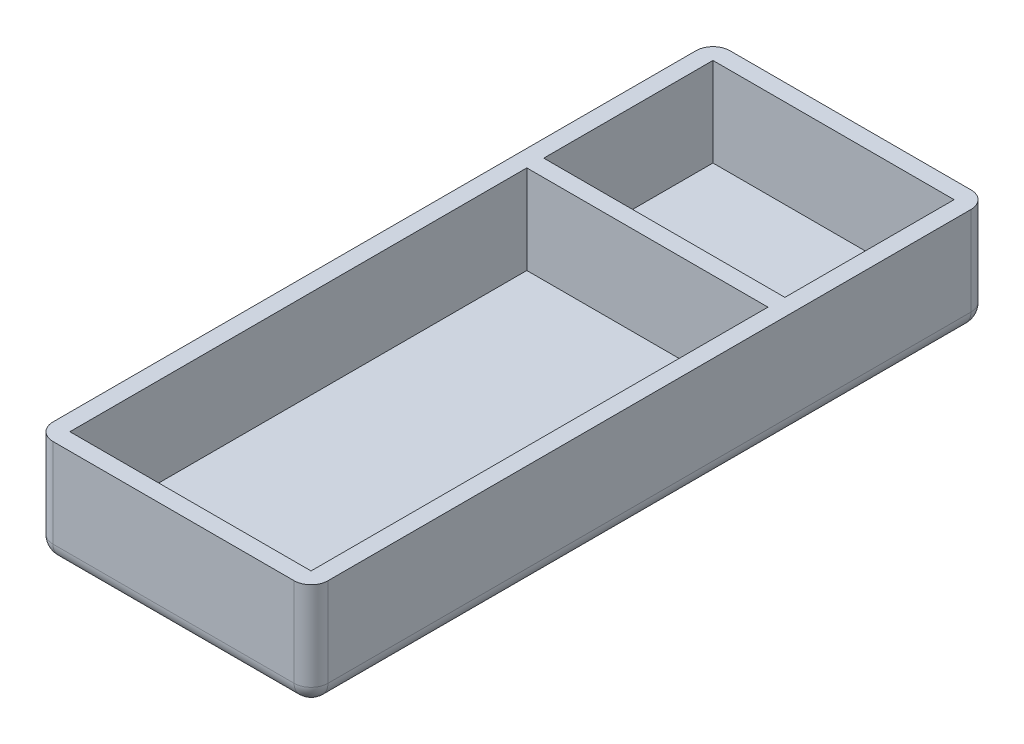
ISO-10303-21;
HEADER;
FILE_DESCRIPTION(('STEP AP214'),'2;1');
FILE_NAME('part.step','',(''),(''),'','','');
FILE_SCHEMA(('AUTOMOTIVE_DESIGN { 1 0 10303 214 1 1 1 1 }'));
ENDSEC;
DATA;
#1=APPLICATION_CONTEXT('core data for automotive mechanical design processes');
#2=APPLICATION_PROTOCOL_DEFINITION('international standard','automotive_design',2000,#1);
#3=PRODUCT_CONTEXT('',#1,'mechanical');
#4=PRODUCT('Part','Part','',(#3));
#5=PRODUCT_RELATED_PRODUCT_CATEGORY('part','',(#4));
#6=PRODUCT_DEFINITION_FORMATION('','',#4);
#7=PRODUCT_DEFINITION_CONTEXT('part definition',#1,'design');
#8=PRODUCT_DEFINITION('design','',#6,#7);
#9=PRODUCT_DEFINITION_SHAPE('','',#8);
#10=(LENGTH_UNIT() NAMED_UNIT(*) SI_UNIT(.MILLI.,.METRE.));
#11=(NAMED_UNIT(*) PLANE_ANGLE_UNIT() SI_UNIT($,.RADIAN.));
#12=(NAMED_UNIT(*) SI_UNIT($,.STERADIAN.) SOLID_ANGLE_UNIT());
#13=UNCERTAINTY_MEASURE_WITH_UNIT(LENGTH_MEASURE(1.E-05),#10,'distance_accuracy_value','');
#14=(GEOMETRIC_REPRESENTATION_CONTEXT(3) GLOBAL_UNCERTAINTY_ASSIGNED_CONTEXT((#13)) GLOBAL_UNIT_ASSIGNED_CONTEXT((#10,
#11,#12)) REPRESENTATION_CONTEXT('',''));
#15=CARTESIAN_POINT('',(0.,0.,0.));
#16=DIRECTION('',(0.,0.,1.));
#17=DIRECTION('',(1.,0.,0.));
#18=AXIS2_PLACEMENT_3D('',#15,#16,#17);
#19=CARTESIAN_POINT('',(28.5,-162.336071161033,76.));
#20=DIRECTION('',(1.,0.,0.));
#21=DIRECTION('',(0.,0.,-1.));
#22=AXIS2_PLACEMENT_3D('',#19,#20,#21);
#23=PLANE('',#22);
#24=DIRECTION('',(0.,-1.,0.));
#25=VECTOR('',#24,1.);
#26=CARTESIAN_POINT('',(28.5,82.1401785086466,-36.));
#27=LINE('',#26,#25);
#28=CARTESIAN_POINT('',(28.5,25.,-36.));
#29=VERTEX_POINT('',#28);
#30=CARTESIAN_POINT('',(28.5,4.,-36.));
#31=VERTEX_POINT('',#30);
#32=EDGE_CURVE('E191',#29,#31,#27,.T.);
#33=ORIENTED_EDGE('',*,*,#32,.F.);
#34=DIRECTION('',(0.,0.,-1.));
#35=VECTOR('',#34,1.);
#36=CARTESIAN_POINT('',(28.5,25.,76.));
#37=LINE('',#36,#35);
#38=CARTESIAN_POINT('',(28.5,25.,-76.));
#39=VERTEX_POINT('',#38);
#40=EDGE_CURVE('E209',#29,#39,#37,.T.);
#41=ORIENTED_EDGE('',*,*,#40,.T.);
#42=DIRECTION('',(0.,1.,0.));
#43=VECTOR('',#42,1.);
#44=CARTESIAN_POINT('',(28.5,-162.336071161033,-76.));
#45=LINE('',#44,#43);
#46=CARTESIAN_POINT('',(28.5,4.,-76.));
#47=VERTEX_POINT('',#46);
#48=EDGE_CURVE('E244',#47,#39,#45,.T.);
#49=ORIENTED_EDGE('',*,*,#48,.F.);
#50=DIRECTION('',(0.,0.,1.));
#51=VECTOR('',#50,1.);
#52=CARTESIAN_POINT('',(28.5,4.,76.));
#53=LINE('',#52,#51);
#54=EDGE_CURVE('E181',#47,#31,#53,.T.);
#55=ORIENTED_EDGE('',*,*,#54,.T.);
#56=EDGE_LOOP('',(#33,#41,#49,#55));
#57=FACE_BOUND('',#56,.T.);
#58=ADVANCED_FACE('F48',(#57),#23,.F.);
#59=CARTESIAN_POINT('',(-28.5,-162.336071161033,76.));
#60=DIRECTION('',(-1.,0.,0.));
#61=DIRECTION('',(0.,0.,1.));
#62=AXIS2_PLACEMENT_3D('',#59,#60,#61);
#63=PLANE('',#62);
#64=DIRECTION('',(0.,-1.,0.));
#65=VECTOR('',#64,1.);
#66=CARTESIAN_POINT('',(-28.5,82.1401785086466,-32.));
#67=LINE('',#66,#65);
#68=CARTESIAN_POINT('',(-28.5,25.,-32.));
#69=VERTEX_POINT('',#68);
#70=CARTESIAN_POINT('',(-28.5,4.,-32.));
#71=VERTEX_POINT('',#70);
#72=EDGE_CURVE('E196',#69,#71,#67,.T.);
#73=ORIENTED_EDGE('',*,*,#72,.F.);
#74=DIRECTION('',(0.,0.,1.));
#75=VECTOR('',#74,1.);
#76=CARTESIAN_POINT('',(-28.5,25.,76.));
#77=LINE('',#76,#75);
#78=CARTESIAN_POINT('',(-28.5,25.,76.));
#79=VERTEX_POINT('',#78);
#80=EDGE_CURVE('E233',#69,#79,#77,.T.);
#81=ORIENTED_EDGE('',*,*,#80,.T.);
#82=DIRECTION('',(0.,1.,0.));
#83=VECTOR('',#82,1.);
#84=CARTESIAN_POINT('',(-28.5,-162.336071161033,76.));
#85=LINE('',#84,#83);
#86=CARTESIAN_POINT('',(-28.5,4.,76.));
#87=VERTEX_POINT('',#86);
#88=EDGE_CURVE('E249',#87,#79,#85,.T.);
#89=ORIENTED_EDGE('',*,*,#88,.F.);
#90=DIRECTION('',(0.,0.,-1.));
#91=VECTOR('',#90,1.);
#92=CARTESIAN_POINT('',(-28.5,4.,76.));
#93=LINE('',#92,#91);
#94=EDGE_CURVE('E219',#87,#71,#93,.T.);
#95=ORIENTED_EDGE('',*,*,#94,.T.);
#96=EDGE_LOOP('',(#73,#81,#89,#95));
#97=FACE_BOUND('',#96,.T.);
#98=ADVANCED_FACE('F437',(#97),#63,.F.);
#99=CARTESIAN_POINT('',(0.,4.,0.));
#100=DIRECTION('',(0.,1.,0.));
#101=DIRECTION('',(0.,0.,1.));
#102=AXIS2_PLACEMENT_3D('',#99,#100,#101);
#103=PLANE('',#102);
#104=DIRECTION('',(-1.,0.,0.));
#105=VECTOR('',#104,1.);
#106=CARTESIAN_POINT('',(-28.5,4.,-36.));
#107=LINE('',#106,#105);
#108=CARTESIAN_POINT('',(-28.5,4.,-36.));
#109=VERTEX_POINT('',#108);
#110=EDGE_CURVE('E206',#31,#109,#107,.T.);
#111=ORIENTED_EDGE('',*,*,#110,.F.);
#112=ORIENTED_EDGE('',*,*,#54,.F.);
#113=DIRECTION('',(1.,0.,0.));
#114=VECTOR('',#113,1.);
#115=CARTESIAN_POINT('',(-28.5,4.,-76.));
#116=LINE('',#115,#114);
#117=CARTESIAN_POINT('',(-28.5,3.99999999999995,-76.));
#118=VERTEX_POINT('',#117);
#119=EDGE_CURVE('E229',#118,#47,#116,.T.);
#120=ORIENTED_EDGE('',*,*,#119,.F.);
#121=EDGE_CURVE('E224',#109,#118,#93,.T.);
#122=ORIENTED_EDGE('',*,*,#121,.F.);
#123=EDGE_LOOP('',(#111,#112,#120,#122));
#124=FACE_BOUND('',#123,.T.);
#125=ADVANCED_FACE('F443',(#124),#103,.T.);
#126=CARTESIAN_POINT('',(-32.5,25.,-80.));
#127=DIRECTION('',(1.,0.,0.));
#128=DIRECTION('',(0.,0.,-1.));
#129=AXIS2_PLACEMENT_3D('',#126,#127,#128);
#130=PLANE('',#129);
#131=DIRECTION('',(0.,0.,1.));
#132=VECTOR('',#131,1.);
#133=CARTESIAN_POINT('',(-32.5,4.,-80.));
#134=LINE('',#133,#132);
#135=CARTESIAN_POINT('',(-32.5,4.,-76.));
#136=VERTEX_POINT('',#135);
#137=CARTESIAN_POINT('',(-32.5,4.,76.));
#138=VERTEX_POINT('',#137);
#139=EDGE_CURVE('E325',#136,#138,#134,.T.);
#140=ORIENTED_EDGE('',*,*,#139,.T.);
#141=DIRECTION('',(0.,-1.,0.));
#142=VECTOR('',#141,1.);
#143=CARTESIAN_POINT('',(-32.5,25.,76.));
#144=LINE('',#143,#142);
#145=CARTESIAN_POINT('',(-32.5,25.,76.));
#146=VERTEX_POINT('',#145);
#147=EDGE_CURVE('E324',#138,#146,#144,.F.);
#148=ORIENTED_EDGE('',*,*,#147,.T.);
#149=DIRECTION('',(0.,0.,1.));
#150=VECTOR('',#149,1.);
#151=CARTESIAN_POINT('',(-32.5,25.,-80.));
#152=LINE('',#151,#150);
#153=CARTESIAN_POINT('',(-32.5,25.,-76.));
#154=VERTEX_POINT('',#153);
#155=EDGE_CURVE('E259',#154,#146,#152,.T.);
#156=ORIENTED_EDGE('',*,*,#155,.F.);
#157=DIRECTION('',(0.,-1.,0.));
#158=VECTOR('',#157,1.);
#159=CARTESIAN_POINT('',(-32.5,25.,-76.));
#160=LINE('',#159,#158);
#161=EDGE_CURVE('E317',#154,#136,#160,.T.);
#162=ORIENTED_EDGE('',*,*,#161,.T.);
#163=EDGE_LOOP('',(#140,#148,#156,#162));
#164=FACE_BOUND('',#163,.T.);
#165=ADVANCED_FACE('F389',(#164),#130,.F.);
#166=CARTESIAN_POINT('',(-32.5,25.,80.));
#167=DIRECTION('',(0.,0.,-1.));
#168=DIRECTION('',(-1.,0.,0.));
#169=AXIS2_PLACEMENT_3D('',#166,#167,#168);
#170=PLANE('',#169);
#171=DIRECTION('',(1.,0.,0.));
#172=VECTOR('',#171,1.);
#173=CARTESIAN_POINT('',(-32.5,4.,80.));
#174=LINE('',#173,#172);
#175=CARTESIAN_POINT('',(-28.5,4.,80.));
#176=VERTEX_POINT('',#175);
#177=CARTESIAN_POINT('',(28.5,4.,80.));
#178=VERTEX_POINT('',#177);
#179=EDGE_CURVE('E279',#176,#178,#174,.T.);
#180=ORIENTED_EDGE('',*,*,#179,.T.);
#181=DIRECTION('',(0.,-1.,0.));
#182=VECTOR('',#181,1.);
#183=CARTESIAN_POINT('',(28.5,25.,80.));
#184=LINE('',#183,#182);
#185=CARTESIAN_POINT('',(28.5,25.,80.));
#186=VERTEX_POINT('',#185);
#187=EDGE_CURVE('E282',#178,#186,#184,.F.);
#188=ORIENTED_EDGE('',*,*,#187,.T.);
#189=DIRECTION('',(1.,0.,0.));
#190=VECTOR('',#189,1.);
#191=CARTESIAN_POINT('',(-32.5,25.,80.));
#192=LINE('',#191,#190);
#193=CARTESIAN_POINT('',(-28.5,25.,80.));
#194=VERTEX_POINT('',#193);
#195=EDGE_CURVE('E263',#194,#186,#192,.T.);
#196=ORIENTED_EDGE('',*,*,#195,.F.);
#197=DIRECTION('',(0.,-1.,0.));
#198=VECTOR('',#197,1.);
#199=CARTESIAN_POINT('',(-28.5,25.,80.));
#200=LINE('',#199,#198);
#201=EDGE_CURVE('E274',#194,#176,#200,.T.);
#202=ORIENTED_EDGE('',*,*,#201,.T.);
#203=EDGE_LOOP('',(#180,#188,#196,#202));
#204=FACE_BOUND('',#203,.T.);
#205=ADVANCED_FACE('F405',(#204),#170,.F.);
#206=CARTESIAN_POINT('',(32.5,25.,-80.));
#207=DIRECTION('',(-1.,0.,0.));
#208=DIRECTION('',(0.,0.,1.));
#209=AXIS2_PLACEMENT_3D('',#206,#207,#208);
#210=PLANE('',#209);
#211=DIRECTION('',(0.,0.,-1.));
#212=VECTOR('',#211,1.);
#213=CARTESIAN_POINT('',(32.5,25.,-80.));
#214=LINE('',#213,#212);
#215=CARTESIAN_POINT('',(32.5,25.,76.));
#216=VERTEX_POINT('',#215);
#217=CARTESIAN_POINT('',(32.5,25.,-76.));
#218=VERTEX_POINT('',#217);
#219=EDGE_CURVE('E270',#216,#218,#214,.T.);
#220=ORIENTED_EDGE('',*,*,#219,.F.);
#221=DIRECTION('',(0.,-1.,0.));
#222=VECTOR('',#221,1.);
#223=CARTESIAN_POINT('',(32.5,25.,76.));
#224=LINE('',#223,#222);
#225=CARTESIAN_POINT('',(32.5,4.,76.));
#226=VERTEX_POINT('',#225);
#227=EDGE_CURVE('E301',#216,#226,#224,.T.);
#228=ORIENTED_EDGE('',*,*,#227,.T.);
#229=DIRECTION('',(0.,0.,-1.));
#230=VECTOR('',#229,1.);
#231=CARTESIAN_POINT('',(32.5,4.,-80.));
#232=LINE('',#231,#230);
#233=CARTESIAN_POINT('',(32.5,4.,-76.));
#234=VERTEX_POINT('',#233);
#235=EDGE_CURVE('E302',#226,#234,#232,.T.);
#236=ORIENTED_EDGE('',*,*,#235,.T.);
#237=DIRECTION('',(0.,-1.,0.));
#238=VECTOR('',#237,1.);
#239=CARTESIAN_POINT('',(32.5,25.,-76.));
#240=LINE('',#239,#238);
#241=EDGE_CURVE('E299',#234,#218,#240,.F.);
#242=ORIENTED_EDGE('',*,*,#241,.T.);
#243=EDGE_LOOP('',(#220,#228,#236,#242));
#244=FACE_BOUND('',#243,.T.);
#245=ADVANCED_FACE('F414',(#244),#210,.F.);
#246=CARTESIAN_POINT('',(-32.5,25.,-80.));
#247=DIRECTION('',(0.,0.,1.));
#248=DIRECTION('',(1.,0.,0.));
#249=AXIS2_PLACEMENT_3D('',#246,#247,#248);
#250=PLANE('',#249);
#251=DIRECTION('',(-1.,0.,0.));
#252=VECTOR('',#251,1.);
#253=CARTESIAN_POINT('',(-32.5,4.,-80.));
#254=LINE('',#253,#252);
#255=CARTESIAN_POINT('',(28.5,4.,-80.));
#256=VERTEX_POINT('',#255);
#257=CARTESIAN_POINT('',(-28.5,4.,-80.));
#258=VERTEX_POINT('',#257);
#259=EDGE_CURVE('E59',#256,#258,#254,.T.);
#260=ORIENTED_EDGE('',*,*,#259,.T.);
#261=DIRECTION('',(0.,-1.,0.));
#262=VECTOR('',#261,1.);
#263=CARTESIAN_POINT('',(-28.5,25.,-80.));
#264=LINE('',#263,#262);
#265=CARTESIAN_POINT('',(-28.5,25.,-80.));
#266=VERTEX_POINT('',#265);
#267=EDGE_CURVE('E12',#258,#266,#264,.F.);
#268=ORIENTED_EDGE('',*,*,#267,.T.);
#269=DIRECTION('',(-1.,0.,0.));
#270=VECTOR('',#269,1.);
#271=CARTESIAN_POINT('',(-32.5,25.,-80.));
#272=LINE('',#271,#270);
#273=CARTESIAN_POINT('',(28.5,25.,-80.));
#274=VERTEX_POINT('',#273);
#275=EDGE_CURVE('E271',#274,#266,#272,.T.);
#276=ORIENTED_EDGE('',*,*,#275,.F.);
#277=DIRECTION('',(0.,-1.,0.));
#278=VECTOR('',#277,1.);
#279=CARTESIAN_POINT('',(28.5,25.,-80.));
#280=LINE('',#279,#278);
#281=EDGE_CURVE('E66',#274,#256,#280,.T.);
#282=ORIENTED_EDGE('',*,*,#281,.T.);
#283=EDGE_LOOP('',(#260,#268,#276,#282));
#284=FACE_BOUND('',#283,.T.);
#285=ADVANCED_FACE('F467',(#284),#250,.F.);
#286=CARTESIAN_POINT('',(0.,25.,0.));
#287=DIRECTION('',(0.,1.,0.));
#288=DIRECTION('',(0.,0.,1.));
#289=AXIS2_PLACEMENT_3D('',#286,#287,#288);
#290=PLANE('',#289);
#291=ORIENTED_EDGE('',*,*,#40,.F.);
#292=DIRECTION('',(-1.,0.,0.));
#293=VECTOR('',#292,1.);
#294=CARTESIAN_POINT('',(-28.5,25.,-36.));
#295=LINE('',#294,#293);
#296=CARTESIAN_POINT('',(-28.5,25.,-36.));
#297=VERTEX_POINT('',#296);
#298=EDGE_CURVE('E211',#29,#297,#295,.T.);
#299=ORIENTED_EDGE('',*,*,#298,.T.);
#300=CARTESIAN_POINT('',(-28.5,25.,-76.));
#301=VERTEX_POINT('',#300);
#302=EDGE_CURVE('E237',#301,#297,#77,.T.);
#303=ORIENTED_EDGE('',*,*,#302,.F.);
#304=DIRECTION('',(-1.,0.,0.));
#305=VECTOR('',#304,1.);
#306=CARTESIAN_POINT('',(-28.5,25.,-76.));
#307=LINE('',#306,#305);
#308=EDGE_CURVE('E232',#39,#301,#307,.T.);
#309=ORIENTED_EDGE('',*,*,#308,.F.);
#310=EDGE_LOOP('',(#291,#299,#303,#309));
#311=FACE_BOUND('',#310,.T.);
#312=CARTESIAN_POINT('',(28.5,25.,76.));
#313=VERTEX_POINT('',#312);
#314=CARTESIAN_POINT('',(28.5,25.,-32.));
#315=VERTEX_POINT('',#314);
#316=EDGE_CURVE('E188',#313,#315,#37,.T.);
#317=ORIENTED_EDGE('',*,*,#316,.F.);
#318=DIRECTION('',(1.,0.,0.));
#319=VECTOR('',#318,1.);
#320=CARTESIAN_POINT('',(-28.5,25.,76.));
#321=LINE('',#320,#319);
#322=EDGE_CURVE('E239',#79,#313,#321,.T.);
#323=ORIENTED_EDGE('',*,*,#322,.F.);
#324=ORIENTED_EDGE('',*,*,#80,.F.);
#325=DIRECTION('',(1.,0.,0.));
#326=VECTOR('',#325,1.);
#327=CARTESIAN_POINT('',(-28.5,25.,-32.));
#328=LINE('',#327,#326);
#329=EDGE_CURVE('E210',#69,#315,#328,.T.);
#330=ORIENTED_EDGE('',*,*,#329,.T.);
#331=EDGE_LOOP('',(#317,#323,#324,#330));
#332=FACE_BOUND('',#331,.T.);
#333=ORIENTED_EDGE('',*,*,#195,.T.);
#334=CARTESIAN_POINT('',(28.5,25.,76.));
#335=DIRECTION('',(0.,1.,0.));
#336=DIRECTION('',(0.,0.,1.));
#337=AXIS2_PLACEMENT_3D('',#334,#335,#336);
#338=CIRCLE('',#337,4.);
#339=EDGE_CURVE('E316',#186,#216,#338,.T.);
#340=ORIENTED_EDGE('',*,*,#339,.T.);
#341=ORIENTED_EDGE('',*,*,#219,.T.);
#342=CARTESIAN_POINT('',(28.5,25.,-76.));
#343=DIRECTION('',(0.,1.,0.));
#344=DIRECTION('',(0.,0.,1.));
#345=AXIS2_PLACEMENT_3D('',#342,#343,#344);
#346=CIRCLE('',#345,4.);
#347=EDGE_CURVE('E307',#218,#274,#346,.T.);
#348=ORIENTED_EDGE('',*,*,#347,.T.);
#349=ORIENTED_EDGE('',*,*,#275,.T.);
#350=CARTESIAN_POINT('',(-28.5,25.,-76.));
#351=DIRECTION('',(0.,1.,0.));
#352=DIRECTION('',(0.,0.,1.));
#353=AXIS2_PLACEMENT_3D('',#350,#351,#352);
#354=CIRCLE('',#353,4.);
#355=EDGE_CURVE('E309',#266,#154,#354,.T.);
#356=ORIENTED_EDGE('',*,*,#355,.T.);
#357=ORIENTED_EDGE('',*,*,#155,.T.);
#358=CARTESIAN_POINT('',(-28.5,25.,76.));
#359=DIRECTION('',(0.,1.,0.));
#360=DIRECTION('',(0.,0.,1.));
#361=AXIS2_PLACEMENT_3D('',#358,#359,#360);
#362=CIRCLE('',#361,4.);
#363=EDGE_CURVE('E311',#146,#194,#362,.T.);
#364=ORIENTED_EDGE('',*,*,#363,.T.);
#365=EDGE_LOOP('',(#333,#340,#341,#348,#349,#356,#357,#364));
#366=FACE_BOUND('',#365,.T.);
#367=ADVANCED_FACE('F396',(#311,#332,#366),#290,.T.);
#368=CARTESIAN_POINT('',(0.,0.,0.));
#369=DIRECTION('',(0.,1.,0.));
#370=DIRECTION('',(0.,0.,1.));
#371=AXIS2_PLACEMENT_3D('',#368,#369,#370);
#372=PLANE('',#371);
#373=DIRECTION('',(0.,0.,-1.));
#374=VECTOR('',#373,1.);
#375=CARTESIAN_POINT('',(28.5,0.,0.));
#376=LINE('',#375,#374);
#377=CARTESIAN_POINT('',(28.5,0.,-76.));
#378=VERTEX_POINT('',#377);
#379=CARTESIAN_POINT('',(28.5,0.,76.));
#380=VERTEX_POINT('',#379);
#381=EDGE_CURVE('E285',#378,#380,#376,.F.);
#382=ORIENTED_EDGE('',*,*,#381,.T.);
#383=DIRECTION('',(1.,0.,0.));
#384=VECTOR('',#383,1.);
#385=CARTESIAN_POINT('',(0.,0.,76.));
#386=LINE('',#385,#384);
#387=CARTESIAN_POINT('',(-28.5,0.,76.));
#388=VERTEX_POINT('',#387);
#389=EDGE_CURVE('E294',#380,#388,#386,.F.);
#390=ORIENTED_EDGE('',*,*,#389,.T.);
#391=DIRECTION('',(0.,0.,1.));
#392=VECTOR('',#391,1.);
#393=CARTESIAN_POINT('',(-28.5,0.,0.));
#394=LINE('',#393,#392);
#395=CARTESIAN_POINT('',(-28.5,0.,-76.));
#396=VERTEX_POINT('',#395);
#397=EDGE_CURVE('E292',#388,#396,#394,.F.);
#398=ORIENTED_EDGE('',*,*,#397,.T.);
#399=DIRECTION('',(-1.,0.,0.));
#400=VECTOR('',#399,1.);
#401=CARTESIAN_POINT('',(0.,0.,-76.));
#402=LINE('',#401,#400);
#403=EDGE_CURVE('E290',#396,#378,#402,.F.);
#404=ORIENTED_EDGE('',*,*,#403,.T.);
#405=EDGE_LOOP('',(#382,#390,#398,#404));
#406=FACE_BOUND('',#405,.T.);
#407=ADVANCED_FACE('F428',(#406),#372,.F.);
#408=ORIENTED_EDGE('',*,*,#316,.T.);
#409=DIRECTION('',(0.,-1.,0.));
#410=VECTOR('',#409,1.);
#411=CARTESIAN_POINT('',(28.5,82.1401785086466,-32.));
#412=LINE('',#411,#410);
#413=CARTESIAN_POINT('',(28.5,4.,-32.));
#414=VERTEX_POINT('',#413);
#415=EDGE_CURVE('E186',#315,#414,#412,.T.);
#416=ORIENTED_EDGE('',*,*,#415,.T.);
#417=CARTESIAN_POINT('',(28.5,4.,76.));
#418=VERTEX_POINT('',#417);
#419=EDGE_CURVE('E172',#414,#418,#53,.T.);
#420=ORIENTED_EDGE('',*,*,#419,.T.);
#421=DIRECTION('',(0.,1.,0.));
#422=VECTOR('',#421,1.);
#423=CARTESIAN_POINT('',(28.5,-162.336071161033,76.));
#424=LINE('',#423,#422);
#425=EDGE_CURVE('E243',#418,#313,#424,.T.);
#426=ORIENTED_EDGE('',*,*,#425,.T.);
#427=EDGE_LOOP('',(#408,#416,#420,#426));
#428=FACE_BOUND('',#427,.T.);
#429=ADVANCED_FACE('F187',(#428),#23,.F.);
#430=CARTESIAN_POINT('',(-28.5,-162.336071161033,76.));
#431=DIRECTION('',(0.,0.,1.));
#432=DIRECTION('',(1.,0.,0.));
#433=AXIS2_PLACEMENT_3D('',#430,#431,#432);
#434=PLANE('',#433);
#435=DIRECTION('',(-1.,0.,0.));
#436=VECTOR('',#435,1.);
#437=CARTESIAN_POINT('',(-28.5,4.,76.));
#438=LINE('',#437,#436);
#439=EDGE_CURVE('E176',#418,#87,#438,.T.);
#440=ORIENTED_EDGE('',*,*,#439,.T.);
#441=ORIENTED_EDGE('',*,*,#88,.T.);
#442=ORIENTED_EDGE('',*,*,#322,.T.);
#443=ORIENTED_EDGE('',*,*,#425,.F.);
#444=EDGE_LOOP('',(#440,#441,#442,#443));
#445=FACE_BOUND('',#444,.T.);
#446=ADVANCED_FACE('F454',(#445),#434,.F.);
#447=ORIENTED_EDGE('',*,*,#302,.T.);
#448=DIRECTION('',(0.,-1.,0.));
#449=VECTOR('',#448,1.);
#450=CARTESIAN_POINT('',(-28.5,82.1401785086466,-36.));
#451=LINE('',#450,#449);
#452=EDGE_CURVE('E205',#297,#109,#451,.T.);
#453=ORIENTED_EDGE('',*,*,#452,.T.);
#454=ORIENTED_EDGE('',*,*,#121,.T.);
#455=DIRECTION('',(0.,1.,0.));
#456=VECTOR('',#455,1.);
#457=CARTESIAN_POINT('',(-28.5,-162.336071161033,-76.));
#458=LINE('',#457,#456);
#459=EDGE_CURVE('E253',#118,#301,#458,.T.);
#460=ORIENTED_EDGE('',*,*,#459,.T.);
#461=EDGE_LOOP('',(#447,#453,#454,#460));
#462=FACE_BOUND('',#461,.T.);
#463=ADVANCED_FACE('F449',(#462),#63,.F.);
#464=CARTESIAN_POINT('',(-28.5,-162.336071161033,-76.));
#465=DIRECTION('',(0.,0.,-1.));
#466=DIRECTION('',(-1.,0.,0.));
#467=AXIS2_PLACEMENT_3D('',#464,#465,#466);
#468=PLANE('',#467);
#469=ORIENTED_EDGE('',*,*,#119,.T.);
#470=ORIENTED_EDGE('',*,*,#48,.T.);
#471=ORIENTED_EDGE('',*,*,#308,.T.);
#472=ORIENTED_EDGE('',*,*,#459,.F.);
#473=EDGE_LOOP('',(#469,#470,#471,#472));
#474=FACE_BOUND('',#473,.T.);
#475=ADVANCED_FACE('F610',(#474),#468,.F.);
#476=DIRECTION('',(1.,0.,0.));
#477=VECTOR('',#476,1.);
#478=CARTESIAN_POINT('',(-28.5,4.,-32.));
#479=LINE('',#478,#477);
#480=EDGE_CURVE('E179',#71,#414,#479,.T.);
#481=ORIENTED_EDGE('',*,*,#480,.F.);
#482=ORIENTED_EDGE('',*,*,#94,.F.);
#483=ORIENTED_EDGE('',*,*,#439,.F.);
#484=ORIENTED_EDGE('',*,*,#419,.F.);
#485=EDGE_LOOP('',(#481,#482,#483,#484));
#486=FACE_BOUND('',#485,.T.);
#487=ADVANCED_FACE('F173',(#486),#103,.T.);
#488=CARTESIAN_POINT('',(-28.5,82.1401785086466,-32.));
#489=DIRECTION('',(0.,0.,-1.));
#490=DIRECTION('',(-1.,0.,0.));
#491=AXIS2_PLACEMENT_3D('',#488,#489,#490);
#492=PLANE('',#491);
#493=ORIENTED_EDGE('',*,*,#329,.F.);
#494=ORIENTED_EDGE('',*,*,#72,.T.);
#495=ORIENTED_EDGE('',*,*,#480,.T.);
#496=ORIENTED_EDGE('',*,*,#415,.F.);
#497=EDGE_LOOP('',(#493,#494,#495,#496));
#498=FACE_BOUND('',#497,.T.);
#499=ADVANCED_FACE('F197',(#498),#492,.F.);
#500=CARTESIAN_POINT('',(-28.5,82.1401785086466,-36.));
#501=DIRECTION('',(0.,0.,1.));
#502=DIRECTION('',(1.,0.,0.));
#503=AXIS2_PLACEMENT_3D('',#500,#501,#502);
#504=PLANE('',#503);
#505=ORIENTED_EDGE('',*,*,#298,.F.);
#506=ORIENTED_EDGE('',*,*,#32,.T.);
#507=ORIENTED_EDGE('',*,*,#110,.T.);
#508=ORIENTED_EDGE('',*,*,#452,.F.);
#509=EDGE_LOOP('',(#505,#506,#507,#508));
#510=FACE_BOUND('',#509,.T.);
#511=ADVANCED_FACE('F563',(#510),#504,.F.);
#512=CARTESIAN_POINT('',(-28.5,25.,-76.));
#513=DIRECTION('',(0.,-1.,0.));
#514=DIRECTION('',(0.,0.,-1.));
#515=AXIS2_PLACEMENT_3D('',#512,#513,#514);
#516=CYLINDRICAL_SURFACE('',#515,4.);
#517=ORIENTED_EDGE('',*,*,#355,.F.);
#518=ORIENTED_EDGE('',*,*,#267,.F.);
#519=CARTESIAN_POINT('',(-28.5,4.,-76.));
#520=DIRECTION('',(0.,-1.,0.));
#521=DIRECTION('',(0.,0.,-1.));
#522=AXIS2_PLACEMENT_3D('',#519,#520,#521);
#523=CIRCLE('',#522,4.);
#524=EDGE_CURVE('E369',#136,#258,#523,.T.);
#525=ORIENTED_EDGE('',*,*,#524,.F.);
#526=ORIENTED_EDGE('',*,*,#161,.F.);
#527=EDGE_LOOP('',(#517,#518,#525,#526));
#528=FACE_BOUND('',#527,.T.);
#529=ADVANCED_FACE('F49',(#528),#516,.T.);
#530=CARTESIAN_POINT('',(28.5,25.,-76.));
#531=DIRECTION('',(0.,-1.,0.));
#532=DIRECTION('',(0.,0.,-1.));
#533=AXIS2_PLACEMENT_3D('',#530,#531,#532);
#534=CYLINDRICAL_SURFACE('',#533,4.);
#535=ORIENTED_EDGE('',*,*,#347,.F.);
#536=ORIENTED_EDGE('',*,*,#241,.F.);
#537=CARTESIAN_POINT('',(28.5,4.,-76.));
#538=DIRECTION('',(0.,-1.,0.));
#539=DIRECTION('',(0.,0.,-1.));
#540=AXIS2_PLACEMENT_3D('',#537,#538,#539);
#541=CIRCLE('',#540,4.);
#542=EDGE_CURVE('E368',#256,#234,#541,.T.);
#543=ORIENTED_EDGE('',*,*,#542,.F.);
#544=ORIENTED_EDGE('',*,*,#281,.F.);
#545=EDGE_LOOP('',(#535,#536,#543,#544));
#546=FACE_BOUND('',#545,.T.);
#547=ADVANCED_FACE('F417',(#546),#534,.T.);
#548=CARTESIAN_POINT('',(-32.5,4.,-76.));
#549=DIRECTION('',(-1.,0.,0.));
#550=DIRECTION('',(0.,0.,1.));
#551=AXIS2_PLACEMENT_3D('',#548,#549,#550);
#552=CYLINDRICAL_SURFACE('',#551,4.);
#553=CARTESIAN_POINT('',(-28.5,4.,-76.));
#554=DIRECTION('',(-1.,0.,0.));
#555=DIRECTION('',(0.,0.,1.));
#556=AXIS2_PLACEMENT_3D('',#553,#554,#555);
#557=CIRCLE('',#556,4.);
#558=EDGE_CURVE('E55',#258,#396,#557,.T.);
#559=ORIENTED_EDGE('',*,*,#558,.F.);
#560=ORIENTED_EDGE('',*,*,#259,.F.);
#561=CARTESIAN_POINT('',(28.5,4.,-76.));
#562=DIRECTION('',(1.,0.,0.));
#563=DIRECTION('',(0.,0.,-1.));
#564=AXIS2_PLACEMENT_3D('',#561,#562,#563);
#565=CIRCLE('',#564,4.);
#566=EDGE_CURVE('E362',#378,#256,#565,.T.);
#567=ORIENTED_EDGE('',*,*,#566,.F.);
#568=ORIENTED_EDGE('',*,*,#403,.F.);
#569=EDGE_LOOP('',(#559,#560,#567,#568));
#570=FACE_BOUND('',#569,.T.);
#571=ADVANCED_FACE('F427',(#570),#552,.T.);
#572=CARTESIAN_POINT('',(-28.5,4.,-76.));
#573=DIRECTION('',(0.,0.,-1.));
#574=DIRECTION('',(-1.,0.,0.));
#575=AXIS2_PLACEMENT_3D('',#572,#573,#574);
#576=SPHERICAL_SURFACE('',#575,4.);
#577=ORIENTED_EDGE('',*,*,#524,.T.);
#578=ORIENTED_EDGE('',*,*,#558,.T.);
#579=CARTESIAN_POINT('',(-28.5,4.,-76.));
#580=DIRECTION('',(0.,0.,-1.));
#581=DIRECTION('',(-1.,0.,0.));
#582=AXIS2_PLACEMENT_3D('',#579,#580,#581);
#583=CIRCLE('',#582,4.);
#584=EDGE_CURVE('E360',#136,#396,#583,.F.);
#585=ORIENTED_EDGE('',*,*,#584,.F.);
#586=EDGE_LOOP('',(#577,#578,#585));
#587=FACE_BOUND('',#586,.T.);
#588=ADVANCED_FACE('F378',(#587),#576,.T.);
#589=CARTESIAN_POINT('',(28.5,4.,-76.));
#590=DIRECTION('',(0.,0.,-1.));
#591=DIRECTION('',(-1.,0.,0.));
#592=AXIS2_PLACEMENT_3D('',#589,#590,#591);
#593=SPHERICAL_SURFACE('',#592,4.);
#594=ORIENTED_EDGE('',*,*,#566,.T.);
#595=ORIENTED_EDGE('',*,*,#542,.T.);
#596=CARTESIAN_POINT('',(28.5,4.,-76.));
#597=DIRECTION('',(0.,0.,-1.));
#598=DIRECTION('',(-1.,0.,0.));
#599=AXIS2_PLACEMENT_3D('',#596,#597,#598);
#600=CIRCLE('',#599,4.);
#601=EDGE_CURVE('E353',#378,#234,#600,.F.);
#602=ORIENTED_EDGE('',*,*,#601,.F.);
#603=EDGE_LOOP('',(#594,#595,#602));
#604=FACE_BOUND('',#603,.T.);
#605=ADVANCED_FACE('F419',(#604),#593,.T.);
#606=CARTESIAN_POINT('',(-28.5,4.,-80.));
#607=DIRECTION('',(0.,0.,1.));
#608=DIRECTION('',(1.,0.,0.));
#609=AXIS2_PLACEMENT_3D('',#606,#607,#608);
#610=CYLINDRICAL_SURFACE('',#609,4.);
#611=ORIENTED_EDGE('',*,*,#584,.T.);
#612=ORIENTED_EDGE('',*,*,#397,.F.);
#613=CARTESIAN_POINT('',(-28.5,4.,76.));
#614=DIRECTION('',(0.,0.,1.));
#615=DIRECTION('',(1.,0.,0.));
#616=AXIS2_PLACEMENT_3D('',#613,#614,#615);
#617=CIRCLE('',#616,4.);
#618=EDGE_CURVE('E348',#138,#388,#617,.T.);
#619=ORIENTED_EDGE('',*,*,#618,.F.);
#620=ORIENTED_EDGE('',*,*,#139,.F.);
#621=EDGE_LOOP('',(#611,#612,#619,#620));
#622=FACE_BOUND('',#621,.T.);
#623=ADVANCED_FACE('F383',(#622),#610,.T.);
#624=CARTESIAN_POINT('',(-28.5,25.,76.));
#625=DIRECTION('',(0.,-1.,0.));
#626=DIRECTION('',(0.,0.,-1.));
#627=AXIS2_PLACEMENT_3D('',#624,#625,#626);
#628=CYLINDRICAL_SURFACE('',#627,4.);
#629=ORIENTED_EDGE('',*,*,#363,.F.);
#630=ORIENTED_EDGE('',*,*,#147,.F.);
#631=CARTESIAN_POINT('',(-28.5,4.,76.));
#632=DIRECTION('',(0.,-1.,0.));
#633=DIRECTION('',(0.,0.,-1.));
#634=AXIS2_PLACEMENT_3D('',#631,#632,#633);
#635=CIRCLE('',#634,4.);
#636=EDGE_CURVE('E347',#176,#138,#635,.T.);
#637=ORIENTED_EDGE('',*,*,#636,.F.);
#638=ORIENTED_EDGE('',*,*,#201,.F.);
#639=EDGE_LOOP('',(#629,#630,#637,#638));
#640=FACE_BOUND('',#639,.T.);
#641=ADVANCED_FACE('F393',(#640),#628,.T.);
#642=CARTESIAN_POINT('',(28.5,25.,76.));
#643=DIRECTION('',(0.,-1.,0.));
#644=DIRECTION('',(0.,0.,-1.));
#645=AXIS2_PLACEMENT_3D('',#642,#643,#644);
#646=CYLINDRICAL_SURFACE('',#645,4.);
#647=ORIENTED_EDGE('',*,*,#339,.F.);
#648=ORIENTED_EDGE('',*,*,#187,.F.);
#649=CARTESIAN_POINT('',(28.5,4.,76.));
#650=DIRECTION('',(0.,-1.,0.));
#651=DIRECTION('',(0.,0.,-1.));
#652=AXIS2_PLACEMENT_3D('',#649,#650,#651);
#653=CIRCLE('',#652,4.);
#654=EDGE_CURVE('E344',#226,#178,#653,.T.);
#655=ORIENTED_EDGE('',*,*,#654,.F.);
#656=ORIENTED_EDGE('',*,*,#227,.F.);
#657=EDGE_LOOP('',(#647,#648,#655,#656));
#658=FACE_BOUND('',#657,.T.);
#659=ADVANCED_FACE('F407',(#658),#646,.T.);
#660=CARTESIAN_POINT('',(28.5,4.,-80.));
#661=DIRECTION('',(0.,0.,-1.));
#662=DIRECTION('',(-1.,0.,0.));
#663=AXIS2_PLACEMENT_3D('',#660,#661,#662);
#664=CYLINDRICAL_SURFACE('',#663,4.);
#665=ORIENTED_EDGE('',*,*,#601,.T.);
#666=ORIENTED_EDGE('',*,*,#235,.F.);
#667=CARTESIAN_POINT('',(28.5,4.,76.));
#668=DIRECTION('',(0.,0.,1.));
#669=DIRECTION('',(1.,0.,0.));
#670=AXIS2_PLACEMENT_3D('',#667,#668,#669);
#671=CIRCLE('',#670,4.);
#672=EDGE_CURVE('E339',#380,#226,#671,.T.);
#673=ORIENTED_EDGE('',*,*,#672,.F.);
#674=ORIENTED_EDGE('',*,*,#381,.F.);
#675=EDGE_LOOP('',(#665,#666,#673,#674));
#676=FACE_BOUND('',#675,.T.);
#677=ADVANCED_FACE('F424',(#676),#664,.T.);
#678=CARTESIAN_POINT('',(-28.5,4.,76.));
#679=DIRECTION('',(-1.,0.,0.));
#680=DIRECTION('',(0.,0.,1.));
#681=AXIS2_PLACEMENT_3D('',#678,#679,#680);
#682=SPHERICAL_SURFACE('',#681,4.);
#683=ORIENTED_EDGE('',*,*,#636,.T.);
#684=ORIENTED_EDGE('',*,*,#618,.T.);
#685=CARTESIAN_POINT('',(-28.5,4.,76.));
#686=DIRECTION('',(-1.,0.,0.));
#687=DIRECTION('',(0.,0.,1.));
#688=AXIS2_PLACEMENT_3D('',#685,#686,#687);
#689=CIRCLE('',#688,4.);
#690=EDGE_CURVE('E333',#176,#388,#689,.F.);
#691=ORIENTED_EDGE('',*,*,#690,.F.);
#692=EDGE_LOOP('',(#683,#684,#691));
#693=FACE_BOUND('',#692,.T.);
#694=ADVANCED_FACE('F482',(#693),#682,.T.);
#695=CARTESIAN_POINT('',(28.5,4.,76.));
#696=DIRECTION('',(1.,0.,0.));
#697=DIRECTION('',(0.,0.,-1.));
#698=AXIS2_PLACEMENT_3D('',#695,#696,#697);
#699=SPHERICAL_SURFACE('',#698,4.);
#700=ORIENTED_EDGE('',*,*,#672,.T.);
#701=ORIENTED_EDGE('',*,*,#654,.T.);
#702=CARTESIAN_POINT('',(28.5,4.,76.));
#703=DIRECTION('',(1.,0.,0.));
#704=DIRECTION('',(0.,0.,-1.));
#705=AXIS2_PLACEMENT_3D('',#702,#703,#704);
#706=CIRCLE('',#705,4.);
#707=EDGE_CURVE('E335',#380,#178,#706,.F.);
#708=ORIENTED_EDGE('',*,*,#707,.F.);
#709=EDGE_LOOP('',(#700,#701,#708));
#710=FACE_BOUND('',#709,.T.);
#711=ADVANCED_FACE('F477',(#710),#699,.T.);
#712=CARTESIAN_POINT('',(-32.5,4.,76.));
#713=DIRECTION('',(1.,0.,0.));
#714=DIRECTION('',(0.,0.,-1.));
#715=AXIS2_PLACEMENT_3D('',#712,#713,#714);
#716=CYLINDRICAL_SURFACE('',#715,4.);
#717=ORIENTED_EDGE('',*,*,#690,.T.);
#718=ORIENTED_EDGE('',*,*,#389,.F.);
#719=ORIENTED_EDGE('',*,*,#707,.T.);
#720=ORIENTED_EDGE('',*,*,#179,.F.);
#721=EDGE_LOOP('',(#717,#718,#719,#720));
#722=FACE_BOUND('',#721,.T.);
#723=ADVANCED_FACE('F480',(#722),#716,.T.);
#724=CLOSED_SHELL('',(#58,#98,#125,#165,#205,#245,#285,#367,#407,#429,#446,#463,#475,#487,#499,
#511,#529,#547,#571,#588,#605,#623,#641,#659,#677,#694,#711,#723));
#725=MANIFOLD_SOLID_BREP('B2',#724);
#726=ADVANCED_BREP_SHAPE_REPRESENTATION('',(#18,#725),#14);
#727=SHAPE_DEFINITION_REPRESENTATION(#9,#726);
ENDSEC;
END-ISO-10303-21;
